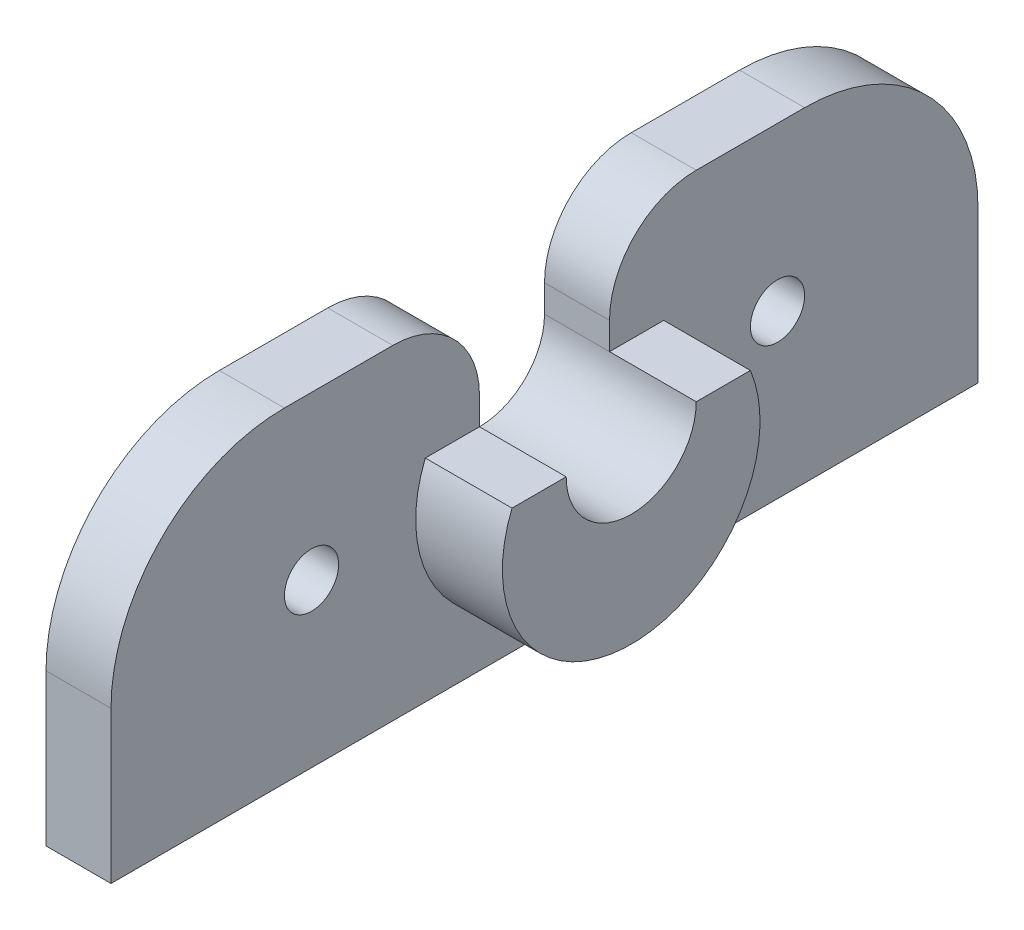
ISO-10303-21;
HEADER;
FILE_DESCRIPTION(('STEP AP214'),'2;1');
FILE_NAME('part.step','',(''),(''),'','','');
FILE_SCHEMA(('AUTOMOTIVE_DESIGN { 1 0 10303 214 1 1 1 1 }'));
ENDSEC;
DATA;
#1=APPLICATION_CONTEXT('core data for automotive mechanical design processes');
#2=APPLICATION_PROTOCOL_DEFINITION('international standard','automotive_design',2000,#1);
#3=PRODUCT_CONTEXT('',#1,'mechanical');
#4=PRODUCT('Part','Part','',(#3));
#5=PRODUCT_RELATED_PRODUCT_CATEGORY('part','',(#4));
#6=PRODUCT_DEFINITION_FORMATION('','',#4);
#7=PRODUCT_DEFINITION_CONTEXT('part definition',#1,'design');
#8=PRODUCT_DEFINITION('design','',#6,#7);
#9=PRODUCT_DEFINITION_SHAPE('','',#8);
#10=(LENGTH_UNIT() NAMED_UNIT(*) SI_UNIT(.MILLI.,.METRE.));
#11=(NAMED_UNIT(*) PLANE_ANGLE_UNIT() SI_UNIT($,.RADIAN.));
#12=(NAMED_UNIT(*) SI_UNIT($,.STERADIAN.) SOLID_ANGLE_UNIT());
#13=UNCERTAINTY_MEASURE_WITH_UNIT(LENGTH_MEASURE(1.E-05),#10,'distance_accuracy_value','');
#14=(GEOMETRIC_REPRESENTATION_CONTEXT(3) GLOBAL_UNCERTAINTY_ASSIGNED_CONTEXT((#13)) GLOBAL_UNIT_ASSIGNED_CONTEXT((#10,
#11,#12)) REPRESENTATION_CONTEXT('',''));
#15=CARTESIAN_POINT('',(0.,0.,0.));
#16=DIRECTION('',(0.,0.,1.));
#17=DIRECTION('',(1.,0.,0.));
#18=AXIS2_PLACEMENT_3D('',#15,#16,#17);
#19=CARTESIAN_POINT('',(3.,0.,0.));
#20=DIRECTION('',(1.,0.,0.));
#21=DIRECTION('',(0.,0.,-1.));
#22=AXIS2_PLACEMENT_3D('',#19,#20,#21);
#23=PLANE('',#22);
#24=DIRECTION('',(0.,0.,1.));
#25=VECTOR('',#24,1.);
#26=CARTESIAN_POINT('',(3.,7.5,-20.));
#27=LINE('',#26,#25);
#28=CARTESIAN_POINT('',(3.,7.5,-12.));
#29=VERTEX_POINT('',#28);
#30=CARTESIAN_POINT('',(3.,7.5,-7.));
#31=VERTEX_POINT('',#30);
#32=EDGE_CURVE('E200',#29,#31,#27,.T.);
#33=ORIENTED_EDGE('',*,*,#32,.T.);
#34=CARTESIAN_POINT('',(3.,3.5,-7.));
#35=DIRECTION('',(1.,0.,0.));
#36=DIRECTION('',(0.,0.,-1.));
#37=AXIS2_PLACEMENT_3D('',#34,#35,#36);
#38=CIRCLE('',#37,4.);
#39=CARTESIAN_POINT('',(3.,3.5,-3.));
#40=VERTEX_POINT('',#39);
#41=EDGE_CURVE('E256',#31,#40,#38,.T.);
#42=ORIENTED_EDGE('',*,*,#41,.T.);
#43=DIRECTION('',(0.,1.,0.));
#44=VECTOR('',#43,1.);
#45=CARTESIAN_POINT('',(3.,2.25,-3.));
#46=LINE('',#45,#44);
#47=CARTESIAN_POINT('',(3.,2.25,-3.));
#48=VERTEX_POINT('',#47);
#49=EDGE_CURVE('E183',#48,#40,#46,.T.);
#50=ORIENTED_EDGE('',*,*,#49,.F.);
#51=DIRECTION('',(0.,0.,1.));
#52=VECTOR('',#51,1.);
#53=CARTESIAN_POINT('',(3.,2.25,-3.));
#54=LINE('',#53,#52);
#55=CARTESIAN_POINT('',(3.,2.25,-5.5));
#56=VERTEX_POINT('',#55);
#57=EDGE_CURVE('E163',#56,#48,#54,.T.);
#58=ORIENTED_EDGE('',*,*,#57,.F.);
#59=CARTESIAN_POINT('',(3.,0.,0.));
#60=DIRECTION('',(1.,0.,0.));
#61=DIRECTION('',(0.,0.,-1.));
#62=AXIS2_PLACEMENT_3D('',#59,#60,#61);
#63=CIRCLE('',#62,5.94243216200236);
#64=CARTESIAN_POINT('',(3.,2.25,5.5));
#65=VERTEX_POINT('',#64);
#66=EDGE_CURVE('E273',#65,#56,#63,.T.);
#67=ORIENTED_EDGE('',*,*,#66,.F.);
#68=DIRECTION('',(0.,0.,1.));
#69=VECTOR('',#68,1.);
#70=CARTESIAN_POINT('',(3.,2.25,3.));
#71=LINE('',#70,#69);
#72=CARTESIAN_POINT('',(3.,2.25,3.));
#73=VERTEX_POINT('',#72);
#74=EDGE_CURVE('E271',#73,#65,#71,.T.);
#75=ORIENTED_EDGE('',*,*,#74,.F.);
#76=DIRECTION('',(0.,-1.,0.));
#77=VECTOR('',#76,1.);
#78=CARTESIAN_POINT('',(3.,2.25,3.));
#79=LINE('',#78,#77);
#80=CARTESIAN_POINT('',(3.,3.5,3.));
#81=VERTEX_POINT('',#80);
#82=EDGE_CURVE('E186',#81,#73,#79,.T.);
#83=ORIENTED_EDGE('',*,*,#82,.F.);
#84=CARTESIAN_POINT('',(3.,3.5,7.));
#85=DIRECTION('',(1.,0.,0.));
#86=DIRECTION('',(0.,0.,-1.));
#87=AXIS2_PLACEMENT_3D('',#84,#85,#86);
#88=CIRCLE('',#87,4.);
#89=CARTESIAN_POINT('',(3.,7.5,7.));
#90=VERTEX_POINT('',#89);
#91=EDGE_CURVE('E254',#81,#90,#88,.T.);
#92=ORIENTED_EDGE('',*,*,#91,.T.);
#93=CARTESIAN_POINT('',(3.,7.5,12.));
#94=VERTEX_POINT('',#93);
#95=EDGE_CURVE('E199',#90,#94,#27,.T.);
#96=ORIENTED_EDGE('',*,*,#95,.T.);
#97=CARTESIAN_POINT('',(3.,-0.500000000000002,12.));
#98=DIRECTION('',(1.,0.,0.));
#99=DIRECTION('',(0.,0.,-1.));
#100=AXIS2_PLACEMENT_3D('',#97,#98,#99);
#101=CIRCLE('',#100,8.);
#102=CARTESIAN_POINT('',(3.,-0.500000000000002,20.));
#103=VERTEX_POINT('',#102);
#104=EDGE_CURVE('E241',#94,#103,#101,.T.);
#105=ORIENTED_EDGE('',*,*,#104,.T.);
#106=DIRECTION('',(0.,-1.,0.));
#107=VECTOR('',#106,1.);
#108=CARTESIAN_POINT('',(3.,-7.5,20.));
#109=LINE('',#108,#107);
#110=CARTESIAN_POINT('',(3.,-7.5,20.));
#111=VERTEX_POINT('',#110);
#112=EDGE_CURVE('E191',#103,#111,#109,.T.);
#113=ORIENTED_EDGE('',*,*,#112,.T.);
#114=DIRECTION('',(0.,0.,-1.));
#115=VECTOR('',#114,1.);
#116=CARTESIAN_POINT('',(3.,-7.5,-20.));
#117=LINE('',#116,#115);
#118=CARTESIAN_POINT('',(3.,-7.5,-20.));
#119=VERTEX_POINT('',#118);
#120=EDGE_CURVE('E193',#111,#119,#117,.T.);
#121=ORIENTED_EDGE('',*,*,#120,.T.);
#122=DIRECTION('',(0.,1.,0.));
#123=VECTOR('',#122,1.);
#124=CARTESIAN_POINT('',(3.,-7.5,-20.));
#125=LINE('',#124,#123);
#126=CARTESIAN_POINT('',(3.,-0.499999999999999,-20.));
#127=VERTEX_POINT('',#126);
#128=EDGE_CURVE('E196',#119,#127,#125,.T.);
#129=ORIENTED_EDGE('',*,*,#128,.T.);
#130=CARTESIAN_POINT('',(3.,-0.499999999999999,-12.));
#131=DIRECTION('',(1.,0.,0.));
#132=DIRECTION('',(0.,0.,-1.));
#133=AXIS2_PLACEMENT_3D('',#130,#131,#132);
#134=CIRCLE('',#133,8.);
#135=EDGE_CURVE('E243',#127,#29,#134,.T.);
#136=ORIENTED_EDGE('',*,*,#135,.T.);
#137=EDGE_LOOP('',(#33,#42,#50,#58,#67,#75,#83,#92,#96,#105,#113,#121,#129,#136));
#138=FACE_BOUND('',#137,.T.);
#139=CARTESIAN_POINT('',(3.,0.,10.75));
#140=DIRECTION('',(1.,0.,0.));
#141=DIRECTION('',(0.,0.,-1.));
#142=AXIS2_PLACEMENT_3D('',#139,#140,#141);
#143=CIRCLE('',#142,1.25);
#144=CARTESIAN_POINT('',(3.,0.,9.5));
#145=VERTEX_POINT('',#144);
#146=EDGE_CURVE('E179',#145,#145,#143,.T.);
#147=ORIENTED_EDGE('',*,*,#146,.F.);
#148=EDGE_LOOP('',(#147));
#149=FACE_BOUND('',#148,.T.);
#150=CARTESIAN_POINT('',(3.,0.,-10.75));
#151=DIRECTION('',(-1.,0.,0.));
#152=DIRECTION('',(0.,0.,1.));
#153=AXIS2_PLACEMENT_3D('',#150,#151,#152);
#154=CIRCLE('',#153,1.25);
#155=CARTESIAN_POINT('',(3.,0.,-9.5));
#156=VERTEX_POINT('',#155);
#157=EDGE_CURVE('E170',#156,#156,#154,.T.);
#158=ORIENTED_EDGE('',*,*,#157,.T.);
#159=EDGE_LOOP('',(#158));
#160=FACE_BOUND('',#159,.T.);
#161=ADVANCED_FACE('F37',(#138,#149,#160),#23,.T.);
#162=CARTESIAN_POINT('',(0.,0.,0.));
#163=DIRECTION('',(1.,0.,0.));
#164=DIRECTION('',(0.,0.,-1.));
#165=AXIS2_PLACEMENT_3D('',#162,#163,#164);
#166=PLANE('',#165);
#167=CARTESIAN_POINT('',(0.,0.,10.75));
#168=DIRECTION('',(1.,0.,0.));
#169=DIRECTION('',(0.,0.,-1.));
#170=AXIS2_PLACEMENT_3D('',#167,#168,#169);
#171=CIRCLE('',#170,1.25);
#172=CARTESIAN_POINT('',(0.,0.,9.5));
#173=VERTEX_POINT('',#172);
#174=EDGE_CURVE('E182',#173,#173,#171,.T.);
#175=ORIENTED_EDGE('',*,*,#174,.T.);
#176=EDGE_LOOP('',(#175));
#177=FACE_BOUND('',#176,.T.);
#178=DIRECTION('',(0.,1.,0.));
#179=VECTOR('',#178,1.);
#180=CARTESIAN_POINT('',(0.,0.,-3.));
#181=LINE('',#180,#179);
#182=CARTESIAN_POINT('',(0.,2.25,-3.));
#183=VERTEX_POINT('',#182);
#184=CARTESIAN_POINT('',(0.,3.5,-3.));
#185=VERTEX_POINT('',#184);
#186=EDGE_CURVE('E219',#183,#185,#181,.T.);
#187=ORIENTED_EDGE('',*,*,#186,.T.);
#188=CARTESIAN_POINT('',(0.,3.5,-7.));
#189=DIRECTION('',(1.,0.,0.));
#190=DIRECTION('',(0.,0.,-1.));
#191=AXIS2_PLACEMENT_3D('',#188,#189,#190);
#192=CIRCLE('',#191,4.);
#193=CARTESIAN_POINT('',(0.,7.5,-7.));
#194=VERTEX_POINT('',#193);
#195=EDGE_CURVE('E261',#185,#194,#192,.F.);
#196=ORIENTED_EDGE('',*,*,#195,.T.);
#197=DIRECTION('',(0.,0.,1.));
#198=VECTOR('',#197,1.);
#199=CARTESIAN_POINT('',(0.,7.5,-20.));
#200=LINE('',#199,#198);
#201=CARTESIAN_POINT('',(0.,7.5,-12.));
#202=VERTEX_POINT('',#201);
#203=EDGE_CURVE('E194',#202,#194,#200,.T.);
#204=ORIENTED_EDGE('',*,*,#203,.F.);
#205=CARTESIAN_POINT('',(0.,-0.499999999999999,-12.));
#206=DIRECTION('',(1.,0.,0.));
#207=DIRECTION('',(0.,0.,-1.));
#208=AXIS2_PLACEMENT_3D('',#205,#206,#207);
#209=CIRCLE('',#208,8.);
#210=CARTESIAN_POINT('',(0.,-0.499999999999999,-20.));
#211=VERTEX_POINT('',#210);
#212=EDGE_CURVE('E237',#202,#211,#209,.F.);
#213=ORIENTED_EDGE('',*,*,#212,.T.);
#214=DIRECTION('',(0.,1.,0.));
#215=VECTOR('',#214,1.);
#216=CARTESIAN_POINT('',(0.,-7.5,-20.));
#217=LINE('',#216,#215);
#218=CARTESIAN_POINT('',(0.,-7.5,-20.));
#219=VERTEX_POINT('',#218);
#220=EDGE_CURVE('E208',#219,#211,#217,.T.);
#221=ORIENTED_EDGE('',*,*,#220,.F.);
#222=DIRECTION('',(0.,0.,-1.));
#223=VECTOR('',#222,1.);
#224=CARTESIAN_POINT('',(0.,-7.5,-20.));
#225=LINE('',#224,#223);
#226=CARTESIAN_POINT('',(0.,-7.5,20.));
#227=VERTEX_POINT('',#226);
#228=EDGE_CURVE('E206',#227,#219,#225,.T.);
#229=ORIENTED_EDGE('',*,*,#228,.F.);
#230=DIRECTION('',(0.,-1.,0.));
#231=VECTOR('',#230,1.);
#232=CARTESIAN_POINT('',(0.,-7.5,20.));
#233=LINE('',#232,#231);
#234=CARTESIAN_POINT('',(0.,-0.500000000000002,20.));
#235=VERTEX_POINT('',#234);
#236=EDGE_CURVE('E204',#235,#227,#233,.T.);
#237=ORIENTED_EDGE('',*,*,#236,.F.);
#238=CARTESIAN_POINT('',(0.,-0.500000000000002,12.));
#239=DIRECTION('',(1.,0.,0.));
#240=DIRECTION('',(0.,0.,-1.));
#241=AXIS2_PLACEMENT_3D('',#238,#239,#240);
#242=CIRCLE('',#241,8.);
#243=CARTESIAN_POINT('',(0.,7.5,12.));
#244=VERTEX_POINT('',#243);
#245=EDGE_CURVE('E234',#235,#244,#242,.F.);
#246=ORIENTED_EDGE('',*,*,#245,.T.);
#247=CARTESIAN_POINT('',(0.,7.5,7.));
#248=VERTEX_POINT('',#247);
#249=EDGE_CURVE('E211',#248,#244,#200,.T.);
#250=ORIENTED_EDGE('',*,*,#249,.F.);
#251=CARTESIAN_POINT('',(0.,3.5,7.));
#252=DIRECTION('',(1.,0.,0.));
#253=DIRECTION('',(0.,0.,-1.));
#254=AXIS2_PLACEMENT_3D('',#251,#252,#253);
#255=CIRCLE('',#254,4.);
#256=CARTESIAN_POINT('',(0.,3.5,3.));
#257=VERTEX_POINT('',#256);
#258=EDGE_CURVE('E52',#248,#257,#255,.F.);
#259=ORIENTED_EDGE('',*,*,#258,.T.);
#260=DIRECTION('',(0.,-1.,0.));
#261=VECTOR('',#260,1.);
#262=CARTESIAN_POINT('',(0.,0.,3.));
#263=LINE('',#262,#261);
#264=CARTESIAN_POINT('',(0.,2.25,3.));
#265=VERTEX_POINT('',#264);
#266=EDGE_CURVE('E225',#257,#265,#263,.T.);
#267=ORIENTED_EDGE('',*,*,#266,.T.);
#268=CARTESIAN_POINT('',(0.,2.25,0.));
#269=DIRECTION('',(1.,0.,0.));
#270=DIRECTION('',(0.,0.,-1.));
#271=AXIS2_PLACEMENT_3D('',#268,#269,#270);
#272=CIRCLE('',#271,3.);
#273=EDGE_CURVE('E222',#265,#183,#272,.T.);
#274=ORIENTED_EDGE('',*,*,#273,.T.);
#275=EDGE_LOOP('',(#187,#196,#204,#213,#221,#229,#237,#246,#250,#259,#267,#274));
#276=FACE_BOUND('',#275,.T.);
#277=CARTESIAN_POINT('',(0.,0.,-10.75));
#278=DIRECTION('',(1.,0.,0.));
#279=DIRECTION('',(0.,0.,-1.));
#280=AXIS2_PLACEMENT_3D('',#277,#278,#279);
#281=CIRCLE('',#280,1.25);
#282=CARTESIAN_POINT('',(0.,0.,-12.));
#283=VERTEX_POINT('',#282);
#284=EDGE_CURVE('E173',#283,#283,#281,.F.);
#285=ORIENTED_EDGE('',*,*,#284,.F.);
#286=EDGE_LOOP('',(#285));
#287=FACE_BOUND('',#286,.T.);
#288=ADVANCED_FACE('F298',(#177,#276,#287),#166,.F.);
#289=CARTESIAN_POINT('',(3.,7.5,-20.));
#290=DIRECTION('',(0.,-1.,0.));
#291=DIRECTION('',(0.,0.,-1.));
#292=AXIS2_PLACEMENT_3D('',#289,#290,#291);
#293=PLANE('',#292);
#294=ORIENTED_EDGE('',*,*,#95,.F.);
#295=DIRECTION('',(1.,0.,0.));
#296=VECTOR('',#295,1.);
#297=CARTESIAN_POINT('',(3.,7.5,7.));
#298=LINE('',#297,#296);
#299=EDGE_CURVE('E11',#90,#248,#298,.F.);
#300=ORIENTED_EDGE('',*,*,#299,.T.);
#301=ORIENTED_EDGE('',*,*,#249,.T.);
#302=DIRECTION('',(-1.,0.,0.));
#303=VECTOR('',#302,1.);
#304=CARTESIAN_POINT('',(3.,7.5,12.));
#305=LINE('',#304,#303);
#306=EDGE_CURVE('E248',#244,#94,#305,.F.);
#307=ORIENTED_EDGE('',*,*,#306,.T.);
#308=EDGE_LOOP('',(#294,#300,#301,#307));
#309=FACE_BOUND('',#308,.T.);
#310=ADVANCED_FACE('F303',(#309),#293,.F.);
#311=CARTESIAN_POINT('',(3.,-7.5,20.));
#312=DIRECTION('',(0.,0.,-1.));
#313=DIRECTION('',(-1.,0.,0.));
#314=AXIS2_PLACEMENT_3D('',#311,#312,#313);
#315=PLANE('',#314);
#316=ORIENTED_EDGE('',*,*,#112,.F.);
#317=DIRECTION('',(-1.,0.,0.));
#318=VECTOR('',#317,1.);
#319=CARTESIAN_POINT('',(3.,-0.500000000000002,20.));
#320=LINE('',#319,#318);
#321=EDGE_CURVE('E245',#103,#235,#320,.T.);
#322=ORIENTED_EDGE('',*,*,#321,.T.);
#323=ORIENTED_EDGE('',*,*,#236,.T.);
#324=DIRECTION('',(-1.,0.,0.));
#325=VECTOR('',#324,1.);
#326=CARTESIAN_POINT('',(3.,-7.5,20.));
#327=LINE('',#326,#325);
#328=EDGE_CURVE('E216',#111,#227,#327,.T.);
#329=ORIENTED_EDGE('',*,*,#328,.F.);
#330=EDGE_LOOP('',(#316,#322,#323,#329));
#331=FACE_BOUND('',#330,.T.);
#332=ADVANCED_FACE('F320',(#331),#315,.F.);
#333=CARTESIAN_POINT('',(3.,-7.5,-20.));
#334=DIRECTION('',(0.,1.,0.));
#335=DIRECTION('',(0.,0.,1.));
#336=AXIS2_PLACEMENT_3D('',#333,#334,#335);
#337=PLANE('',#336);
#338=ORIENTED_EDGE('',*,*,#228,.T.);
#339=DIRECTION('',(-1.,0.,0.));
#340=VECTOR('',#339,1.);
#341=CARTESIAN_POINT('',(3.,-7.5,-20.));
#342=LINE('',#341,#340);
#343=EDGE_CURVE('E203',#119,#219,#342,.T.);
#344=ORIENTED_EDGE('',*,*,#343,.F.);
#345=ORIENTED_EDGE('',*,*,#120,.F.);
#346=ORIENTED_EDGE('',*,*,#328,.T.);
#347=EDGE_LOOP('',(#338,#344,#345,#346));
#348=FACE_BOUND('',#347,.T.);
#349=ADVANCED_FACE('F316',(#348),#337,.F.);
#350=CARTESIAN_POINT('',(3.,-7.5,-20.));
#351=DIRECTION('',(0.,0.,1.));
#352=DIRECTION('',(1.,0.,0.));
#353=AXIS2_PLACEMENT_3D('',#350,#351,#352);
#354=PLANE('',#353);
#355=ORIENTED_EDGE('',*,*,#220,.T.);
#356=DIRECTION('',(-1.,0.,0.));
#357=VECTOR('',#356,1.);
#358=CARTESIAN_POINT('',(3.,-0.499999999999999,-20.));
#359=LINE('',#358,#357);
#360=EDGE_CURVE('E239',#211,#127,#359,.F.);
#361=ORIENTED_EDGE('',*,*,#360,.T.);
#362=ORIENTED_EDGE('',*,*,#128,.F.);
#363=ORIENTED_EDGE('',*,*,#343,.T.);
#364=EDGE_LOOP('',(#355,#361,#362,#363));
#365=FACE_BOUND('',#364,.T.);
#366=ADVANCED_FACE('F312',(#365),#354,.F.);
#367=ORIENTED_EDGE('',*,*,#203,.T.);
#368=DIRECTION('',(1.,0.,0.));
#369=VECTOR('',#368,1.);
#370=CARTESIAN_POINT('',(3.,7.5,-7.));
#371=LINE('',#370,#369);
#372=EDGE_CURVE('E251',#194,#31,#371,.T.);
#373=ORIENTED_EDGE('',*,*,#372,.T.);
#374=ORIENTED_EDGE('',*,*,#32,.F.);
#375=DIRECTION('',(-1.,0.,0.));
#376=VECTOR('',#375,1.);
#377=CARTESIAN_POINT('',(3.,7.5,-12.));
#378=LINE('',#377,#376);
#379=EDGE_CURVE('E227',#29,#202,#378,.T.);
#380=ORIENTED_EDGE('',*,*,#379,.T.);
#381=EDGE_LOOP('',(#367,#373,#374,#380));
#382=FACE_BOUND('',#381,.T.);
#383=ADVANCED_FACE('F309',(#382),#293,.F.);
#384=CARTESIAN_POINT('',(-2.,2.25,0.));
#385=DIRECTION('',(1.,0.,0.));
#386=DIRECTION('',(0.,0.,-1.));
#387=AXIS2_PLACEMENT_3D('',#384,#385,#386);
#388=CYLINDRICAL_SURFACE('',#387,3.);
#389=DIRECTION('',(1.,0.,0.));
#390=VECTOR('',#389,1.);
#391=CARTESIAN_POINT('',(-2.,2.25,3.));
#392=LINE('',#391,#390);
#393=EDGE_CURVE('E169',#265,#73,#392,.T.);
#394=ORIENTED_EDGE('',*,*,#393,.T.);
#395=DIRECTION('',(-1.,0.,0.));
#396=VECTOR('',#395,1.);
#397=CARTESIAN_POINT('',(7.,2.25,3.));
#398=LINE('',#397,#396);
#399=CARTESIAN_POINT('',(7.,2.25,3.));
#400=VERTEX_POINT('',#399);
#401=EDGE_CURVE('E148',#400,#73,#398,.T.);
#402=ORIENTED_EDGE('',*,*,#401,.F.);
#403=CARTESIAN_POINT('',(7.,2.25,0.));
#404=DIRECTION('',(-1.,0.,0.));
#405=DIRECTION('',(0.,0.,-1.));
#406=AXIS2_PLACEMENT_3D('',#403,#404,#405);
#407=CIRCLE('',#406,3.);
#408=CARTESIAN_POINT('',(7.,2.25,-3.));
#409=VERTEX_POINT('',#408);
#410=EDGE_CURVE('E154',#409,#400,#407,.T.);
#411=ORIENTED_EDGE('',*,*,#410,.F.);
#412=DIRECTION('',(-1.,0.,0.));
#413=VECTOR('',#412,1.);
#414=CARTESIAN_POINT('',(7.,2.25,-3.));
#415=LINE('',#414,#413);
#416=EDGE_CURVE('E281',#409,#48,#415,.T.);
#417=ORIENTED_EDGE('',*,*,#416,.T.);
#418=DIRECTION('',(1.,0.,0.));
#419=VECTOR('',#418,1.);
#420=CARTESIAN_POINT('',(-2.,2.25,-3.));
#421=LINE('',#420,#419);
#422=EDGE_CURVE('E188',#183,#48,#421,.T.);
#423=ORIENTED_EDGE('',*,*,#422,.F.);
#424=ORIENTED_EDGE('',*,*,#273,.F.);
#425=EDGE_LOOP('',(#394,#402,#411,#417,#423,#424));
#426=FACE_BOUND('',#425,.T.);
#427=ADVANCED_FACE('F166',(#426),#388,.F.);
#428=CARTESIAN_POINT('',(-2.,2.25,3.));
#429=DIRECTION('',(0.,0.,1.));
#430=DIRECTION('',(1.,0.,0.));
#431=AXIS2_PLACEMENT_3D('',#428,#429,#430);
#432=PLANE('',#431);
#433=ORIENTED_EDGE('',*,*,#266,.F.);
#434=DIRECTION('',(1.,0.,0.));
#435=VECTOR('',#434,1.);
#436=CARTESIAN_POINT('',(-2.,3.5,3.));
#437=LINE('',#436,#435);
#438=EDGE_CURVE('E45',#257,#81,#437,.T.);
#439=ORIENTED_EDGE('',*,*,#438,.T.);
#440=ORIENTED_EDGE('',*,*,#82,.T.);
#441=ORIENTED_EDGE('',*,*,#393,.F.);
#442=EDGE_LOOP('',(#433,#439,#440,#441));
#443=FACE_BOUND('',#442,.T.);
#444=ADVANCED_FACE('F266',(#443),#432,.F.);
#445=CARTESIAN_POINT('',(-2.,2.25,-3.));
#446=DIRECTION('',(0.,0.,-1.));
#447=DIRECTION('',(-1.,0.,0.));
#448=AXIS2_PLACEMENT_3D('',#445,#446,#447);
#449=PLANE('',#448);
#450=ORIENTED_EDGE('',*,*,#49,.T.);
#451=DIRECTION('',(1.,0.,0.));
#452=VECTOR('',#451,1.);
#453=CARTESIAN_POINT('',(-2.,3.5,-3.));
#454=LINE('',#453,#452);
#455=EDGE_CURVE('E258',#40,#185,#454,.F.);
#456=ORIENTED_EDGE('',*,*,#455,.T.);
#457=ORIENTED_EDGE('',*,*,#186,.F.);
#458=ORIENTED_EDGE('',*,*,#422,.T.);
#459=EDGE_LOOP('',(#450,#456,#457,#458));
#460=FACE_BOUND('',#459,.T.);
#461=ADVANCED_FACE('F362',(#460),#449,.F.);
#462=CARTESIAN_POINT('',(-2.,0.,10.75));
#463=DIRECTION('',(1.,0.,0.));
#464=DIRECTION('',(0.,0.,-1.));
#465=AXIS2_PLACEMENT_3D('',#462,#463,#464);
#466=CYLINDRICAL_SURFACE('',#465,1.25);
#467=ORIENTED_EDGE('',*,*,#146,.T.);
#468=EDGE_LOOP('',(#467));
#469=FACE_BOUND('',#468,.T.);
#470=ORIENTED_EDGE('',*,*,#174,.F.);
#471=EDGE_LOOP('',(#470));
#472=FACE_BOUND('',#471,.T.);
#473=ADVANCED_FACE('F365',(#469,#472),#466,.F.);
#474=CARTESIAN_POINT('',(-2.,0.,-10.75));
#475=DIRECTION('',(1.,0.,0.));
#476=DIRECTION('',(0.,0.,-1.));
#477=AXIS2_PLACEMENT_3D('',#474,#475,#476);
#478=CYLINDRICAL_SURFACE('',#477,1.25);
#479=ORIENTED_EDGE('',*,*,#157,.F.);
#480=EDGE_LOOP('',(#479));
#481=FACE_BOUND('',#480,.T.);
#482=ORIENTED_EDGE('',*,*,#284,.T.);
#483=EDGE_LOOP('',(#482));
#484=FACE_BOUND('',#483,.T.);
#485=ADVANCED_FACE('F328',(#481,#484),#478,.F.);
#486=CARTESIAN_POINT('',(3.,-0.499999999999999,-12.));
#487=DIRECTION('',(-1.,0.,0.));
#488=DIRECTION('',(0.,0.,1.));
#489=AXIS2_PLACEMENT_3D('',#486,#487,#488);
#490=CYLINDRICAL_SURFACE('',#489,8.);
#491=ORIENTED_EDGE('',*,*,#135,.F.);
#492=ORIENTED_EDGE('',*,*,#360,.F.);
#493=ORIENTED_EDGE('',*,*,#212,.F.);
#494=ORIENTED_EDGE('',*,*,#379,.F.);
#495=EDGE_LOOP('',(#491,#492,#493,#494));
#496=FACE_BOUND('',#495,.T.);
#497=ADVANCED_FACE('F325',(#496),#490,.T.);
#498=CARTESIAN_POINT('',(3.,-0.500000000000002,12.));
#499=DIRECTION('',(-1.,0.,0.));
#500=DIRECTION('',(0.,0.,1.));
#501=AXIS2_PLACEMENT_3D('',#498,#499,#500);
#502=CYLINDRICAL_SURFACE('',#501,8.);
#503=ORIENTED_EDGE('',*,*,#104,.F.);
#504=ORIENTED_EDGE('',*,*,#306,.F.);
#505=ORIENTED_EDGE('',*,*,#245,.F.);
#506=ORIENTED_EDGE('',*,*,#321,.F.);
#507=EDGE_LOOP('',(#503,#504,#505,#506));
#508=FACE_BOUND('',#507,.T.);
#509=ADVANCED_FACE('F295',(#508),#502,.T.);
#510=CARTESIAN_POINT('',(7.,2.25,3.));
#511=DIRECTION('',(0.,-1.,0.));
#512=DIRECTION('',(0.,0.,-1.));
#513=AXIS2_PLACEMENT_3D('',#510,#511,#512);
#514=PLANE('',#513);
#515=ORIENTED_EDGE('',*,*,#74,.T.);
#516=DIRECTION('',(-1.,0.,0.));
#517=VECTOR('',#516,1.);
#518=CARTESIAN_POINT('',(7.,2.25,5.5));
#519=LINE('',#518,#517);
#520=CARTESIAN_POINT('',(7.,2.25,5.5));
#521=VERTEX_POINT('',#520);
#522=EDGE_CURVE('E150',#521,#65,#519,.T.);
#523=ORIENTED_EDGE('',*,*,#522,.F.);
#524=DIRECTION('',(0.,0.,1.));
#525=VECTOR('',#524,1.);
#526=CARTESIAN_POINT('',(7.,2.25,3.));
#527=LINE('',#526,#525);
#528=EDGE_CURVE('E143',#400,#521,#527,.T.);
#529=ORIENTED_EDGE('',*,*,#528,.F.);
#530=ORIENTED_EDGE('',*,*,#401,.T.);
#531=EDGE_LOOP('',(#515,#523,#529,#530));
#532=FACE_BOUND('',#531,.T.);
#533=ADVANCED_FACE('F146',(#532),#514,.F.);
#534=CARTESIAN_POINT('',(7.,0.,0.));
#535=DIRECTION('',(-1.,0.,0.));
#536=DIRECTION('',(0.,0.,1.));
#537=AXIS2_PLACEMENT_3D('',#534,#535,#536);
#538=CYLINDRICAL_SURFACE('',#537,5.94243216200236);
#539=ORIENTED_EDGE('',*,*,#66,.T.);
#540=DIRECTION('',(-1.,0.,0.));
#541=VECTOR('',#540,1.);
#542=CARTESIAN_POINT('',(7.,2.25,-5.5));
#543=LINE('',#542,#541);
#544=CARTESIAN_POINT('',(7.,2.25,-5.5));
#545=VERTEX_POINT('',#544);
#546=EDGE_CURVE('E175',#545,#56,#543,.T.);
#547=ORIENTED_EDGE('',*,*,#546,.F.);
#548=CARTESIAN_POINT('',(7.,0.,0.));
#549=DIRECTION('',(1.,0.,0.));
#550=DIRECTION('',(0.,0.,-1.));
#551=AXIS2_PLACEMENT_3D('',#548,#549,#550);
#552=CIRCLE('',#551,5.94243216200236);
#553=EDGE_CURVE('E153',#521,#545,#552,.T.);
#554=ORIENTED_EDGE('',*,*,#553,.F.);
#555=ORIENTED_EDGE('',*,*,#522,.T.);
#556=EDGE_LOOP('',(#539,#547,#554,#555));
#557=FACE_BOUND('',#556,.T.);
#558=ADVANCED_FACE('F287',(#557),#538,.T.);
#559=CARTESIAN_POINT('',(7.,2.25,-3.));
#560=DIRECTION('',(0.,-1.,0.));
#561=DIRECTION('',(0.,0.,-1.));
#562=AXIS2_PLACEMENT_3D('',#559,#560,#561);
#563=PLANE('',#562);
#564=ORIENTED_EDGE('',*,*,#57,.T.);
#565=ORIENTED_EDGE('',*,*,#416,.F.);
#566=DIRECTION('',(0.,0.,1.));
#567=VECTOR('',#566,1.);
#568=CARTESIAN_POINT('',(7.,2.25,-3.));
#569=LINE('',#568,#567);
#570=EDGE_CURVE('E159',#545,#409,#569,.T.);
#571=ORIENTED_EDGE('',*,*,#570,.F.);
#572=ORIENTED_EDGE('',*,*,#546,.T.);
#573=EDGE_LOOP('',(#564,#565,#571,#572));
#574=FACE_BOUND('',#573,.T.);
#575=ADVANCED_FACE('F285',(#574),#563,.F.);
#576=CARTESIAN_POINT('',(7.,2.25,0.));
#577=DIRECTION('',(1.,0.,0.));
#578=DIRECTION('',(0.,0.,-1.));
#579=AXIS2_PLACEMENT_3D('',#576,#577,#578);
#580=PLANE('',#579);
#581=ORIENTED_EDGE('',*,*,#410,.T.);
#582=ORIENTED_EDGE('',*,*,#528,.T.);
#583=ORIENTED_EDGE('',*,*,#553,.T.);
#584=ORIENTED_EDGE('',*,*,#570,.T.);
#585=EDGE_LOOP('',(#581,#582,#583,#584));
#586=FACE_BOUND('',#585,.T.);
#587=ADVANCED_FACE('F157',(#586),#580,.T.);
#588=CARTESIAN_POINT('',(3.,3.5,-7.));
#589=DIRECTION('',(1.,0.,0.));
#590=DIRECTION('',(0.,0.,-1.));
#591=AXIS2_PLACEMENT_3D('',#588,#589,#590);
#592=CYLINDRICAL_SURFACE('',#591,4.);
#593=ORIENTED_EDGE('',*,*,#195,.F.);
#594=ORIENTED_EDGE('',*,*,#455,.F.);
#595=ORIENTED_EDGE('',*,*,#41,.F.);
#596=ORIENTED_EDGE('',*,*,#372,.F.);
#597=EDGE_LOOP('',(#593,#594,#595,#596));
#598=FACE_BOUND('',#597,.T.);
#599=ADVANCED_FACE('F332',(#598),#592,.T.);
#600=CARTESIAN_POINT('',(-2.,3.5,7.));
#601=DIRECTION('',(1.,0.,0.));
#602=DIRECTION('',(0.,0.,-1.));
#603=AXIS2_PLACEMENT_3D('',#600,#601,#602);
#604=CYLINDRICAL_SURFACE('',#603,4.);
#605=ORIENTED_EDGE('',*,*,#258,.F.);
#606=ORIENTED_EDGE('',*,*,#299,.F.);
#607=ORIENTED_EDGE('',*,*,#91,.F.);
#608=ORIENTED_EDGE('',*,*,#438,.F.);
#609=EDGE_LOOP('',(#605,#606,#607,#608));
#610=FACE_BOUND('',#609,.T.);
#611=ADVANCED_FACE('F39',(#610),#604,.T.);
#612=CLOSED_SHELL('',(#161,#288,#310,#332,#349,#366,#383,#427,#444,#461,#473,#485,#497,#509,
#533,#558,#575,#587,#599,#611));
#613=MANIFOLD_SOLID_BREP('B2',#612);
#614=ADVANCED_BREP_SHAPE_REPRESENTATION('',(#18,#613),#14);
#615=SHAPE_DEFINITION_REPRESENTATION(#9,#614);
ENDSEC;
END-ISO-10303-21;
